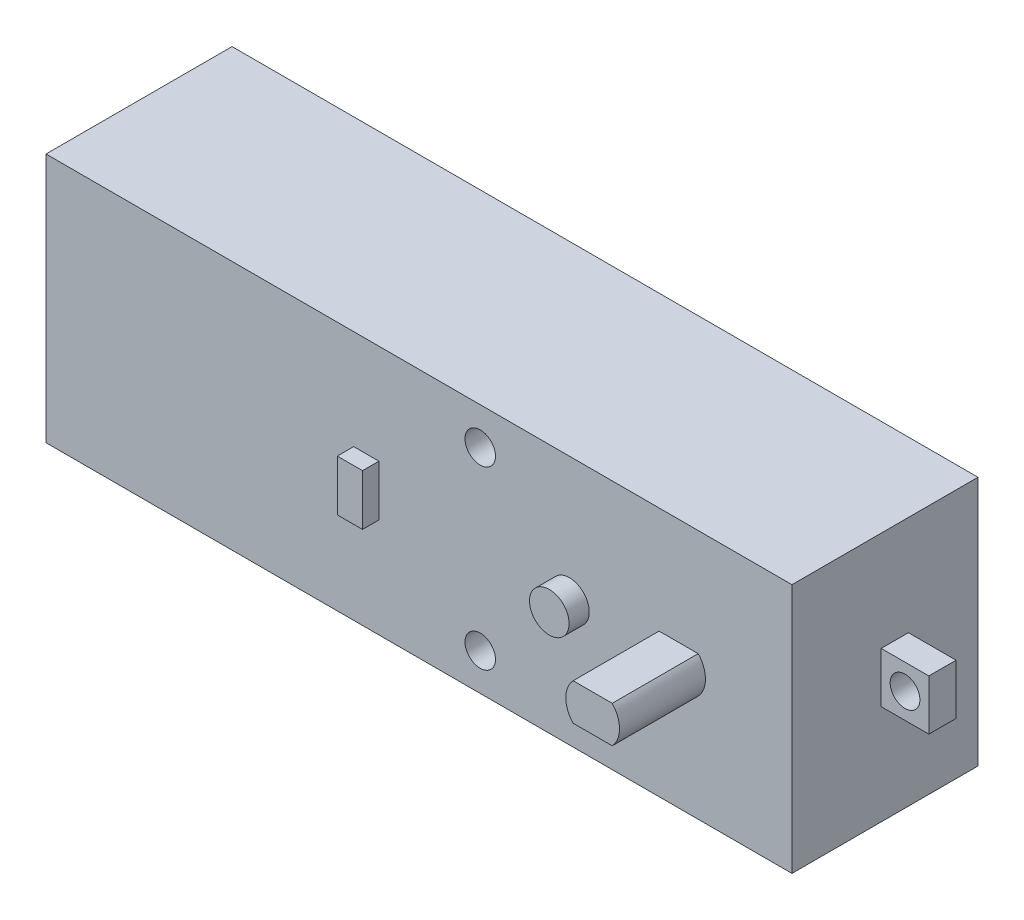
ISO-10303-21;
HEADER;
FILE_DESCRIPTION(('STEP AP214'),'2;1');
FILE_NAME('part.step','',(''),(''),'','','');
FILE_SCHEMA(('AUTOMOTIVE_DESIGN { 1 0 10303 214 1 1 1 1 }'));
ENDSEC;
DATA;
#1=APPLICATION_CONTEXT('core data for automotive mechanical design processes');
#2=APPLICATION_PROTOCOL_DEFINITION('international standard','automotive_design',2000,#1);
#3=PRODUCT_CONTEXT('',#1,'mechanical');
#4=PRODUCT('Part','Part','',(#3));
#5=PRODUCT_RELATED_PRODUCT_CATEGORY('part','',(#4));
#6=PRODUCT_DEFINITION_FORMATION('','',#4);
#7=PRODUCT_DEFINITION_CONTEXT('part definition',#1,'design');
#8=PRODUCT_DEFINITION('design','',#6,#7);
#9=PRODUCT_DEFINITION_SHAPE('','',#8);
#10=(LENGTH_UNIT() NAMED_UNIT(*) SI_UNIT(.MILLI.,.METRE.));
#11=(NAMED_UNIT(*) PLANE_ANGLE_UNIT() SI_UNIT($,.RADIAN.));
#12=(NAMED_UNIT(*) SI_UNIT($,.STERADIAN.) SOLID_ANGLE_UNIT());
#13=UNCERTAINTY_MEASURE_WITH_UNIT(LENGTH_MEASURE(1.E-05),#10,'distance_accuracy_value','');
#14=(GEOMETRIC_REPRESENTATION_CONTEXT(3) GLOBAL_UNCERTAINTY_ASSIGNED_CONTEXT((#13)) GLOBAL_UNIT_ASSIGNED_CONTEXT((#10,
#11,#12)) REPRESENTATION_CONTEXT('',''));
#15=CARTESIAN_POINT('',(0.,0.,0.));
#16=DIRECTION('',(0.,0.,1.));
#17=DIRECTION('',(1.,0.,0.));
#18=AXIS2_PLACEMENT_3D('',#15,#16,#17);
#19=CARTESIAN_POINT('',(0.,0.,18.7452));
#20=DIRECTION('',(0.,0.,-1.));
#21=DIRECTION('',(-1.,0.,0.));
#22=AXIS2_PLACEMENT_3D('',#19,#20,#21);
#23=PLANE('',#22);
#24=DIRECTION('',(0.,-1.,0.));
#25=VECTOR('',#24,1.);
#26=CARTESIAN_POINT('',(0.,0.,18.7452));
#27=LINE('',#26,#25);
#28=CARTESIAN_POINT('',(0.,25.1968,18.7452));
#29=VERTEX_POINT('',#28);
#30=CARTESIAN_POINT('',(0.,0.,18.7452));
#31=VERTEX_POINT('',#30);
#32=EDGE_CURVE('E301',#29,#31,#27,.T.);
#33=ORIENTED_EDGE('',*,*,#32,.T.);
#34=DIRECTION('',(1.,0.,0.));
#35=VECTOR('',#34,1.);
#36=CARTESIAN_POINT('',(0.,0.,18.7452));
#37=LINE('',#36,#35);
#38=CARTESIAN_POINT('',(75.1586,-7.49400541621981E-13,18.7452000000015));
#39=VERTEX_POINT('',#38);
#40=EDGE_CURVE('E305',#31,#39,#37,.T.);
#41=ORIENTED_EDGE('',*,*,#40,.T.);
#42=DIRECTION('',(0.,1.,0.));
#43=VECTOR('',#42,1.);
#44=CARTESIAN_POINT('',(75.1586,-7.49400541621981E-13,18.7452000000015));
#45=LINE('',#44,#43);
#46=CARTESIAN_POINT('',(75.1586,25.1967999999992,18.7452000000015));
#47=VERTEX_POINT('',#46);
#48=EDGE_CURVE('E309',#39,#47,#45,.T.);
#49=ORIENTED_EDGE('',*,*,#48,.T.);
#50=DIRECTION('',(-1.,0.,0.));
#51=VECTOR('',#50,1.);
#52=CARTESIAN_POINT('',(0.,25.1968,18.7452));
#53=LINE('',#52,#51);
#54=EDGE_CURVE('E312',#47,#29,#53,.T.);
#55=ORIENTED_EDGE('',*,*,#54,.T.);
#56=EDGE_LOOP('',(#33,#41,#49,#55));
#57=FACE_BOUND('',#56,.T.);
#58=CARTESIAN_POINT('',(52.7431,12.5983999999993,18.7452));
#59=DIRECTION('',(0.,0.,-1.));
#60=DIRECTION('',(-1.,0.,0.));
#61=AXIS2_PLACEMENT_3D('',#58,#59,#60);
#62=CIRCLE('',#61,1.9939);
#63=CARTESIAN_POINT('',(50.7492,12.5983999999993,18.7452));
#64=VERTEX_POINT('',#63);
#65=EDGE_CURVE('E342',#64,#64,#62,.F.);
#66=ORIENTED_EDGE('',*,*,#65,.F.);
#67=EDGE_LOOP('',(#66));
#68=FACE_BOUND('',#67,.T.);
#69=CARTESIAN_POINT('',(63.7413,12.5983999999993,18.7452));
#70=DIRECTION('',(0.,0.,-1.));
#71=DIRECTION('',(-1.,0.,0.));
#72=AXIS2_PLACEMENT_3D('',#69,#70,#71);
#73=CIRCLE('',#72,2.7051);
#74=CARTESIAN_POINT('',(65.7109467627471,10.7441999999992,18.7452000000015));
#75=VERTEX_POINT('',#74);
#76=CARTESIAN_POINT('',(65.7109467627471,14.4525999999992,18.7452000000015));
#77=VERTEX_POINT('',#76);
#78=EDGE_CURVE('E13',#75,#77,#73,.F.);
#79=ORIENTED_EDGE('',*,*,#78,.F.);
#80=DIRECTION('',(1.,0.,0.));
#81=VECTOR('',#80,1.);
#82=CARTESIAN_POINT('',(0.,10.7442,18.7452));
#83=LINE('',#82,#81);
#84=CARTESIAN_POINT('',(61.7716532372529,10.7441999999992,18.7452));
#85=VERTEX_POINT('',#84);
#86=EDGE_CURVE('E210',#85,#75,#83,.T.);
#87=ORIENTED_EDGE('',*,*,#86,.F.);
#88=CARTESIAN_POINT('',(61.7716532372529,14.4525999999992,18.7452));
#89=VERTEX_POINT('',#88);
#90=EDGE_CURVE('E60',#89,#85,#73,.F.);
#91=ORIENTED_EDGE('',*,*,#90,.F.);
#92=DIRECTION('',(1.,0.,0.));
#93=VECTOR('',#92,1.);
#94=CARTESIAN_POINT('',(0.,14.4526,18.7452));
#95=LINE('',#94,#93);
#96=EDGE_CURVE('E221',#89,#77,#95,.T.);
#97=ORIENTED_EDGE('',*,*,#96,.T.);
#98=EDGE_LOOP('',(#79,#87,#91,#97));
#99=FACE_BOUND('',#98,.T.);
#100=CARTESIAN_POINT('',(43.7515,3.73379999999926,18.7452000000015));
#101=DIRECTION('',(0.,0.,1.));
#102=DIRECTION('',(1.,0.,0.));
#103=AXIS2_PLACEMENT_3D('',#100,#101,#102);
#104=CIRCLE('',#103,1.5367);
#105=CARTESIAN_POINT('',(45.2882,3.73379999999924,18.7452000000015));
#106=VERTEX_POINT('',#105);
#107=EDGE_CURVE('E194',#106,#106,#104,.T.);
#108=ORIENTED_EDGE('',*,*,#107,.F.);
#109=EDGE_LOOP('',(#108));
#110=FACE_BOUND('',#109,.T.);
#111=CARTESIAN_POINT('',(43.7515,21.4629999999993,18.7452000000001));
#112=DIRECTION('',(0.,0.,1.));
#113=DIRECTION('',(1.,0.,0.));
#114=AXIS2_PLACEMENT_3D('',#111,#112,#113);
#115=CIRCLE('',#114,1.5367);
#116=CARTESIAN_POINT('',(45.2882,21.4629999999992,18.7452000000001));
#117=VERTEX_POINT('',#116);
#118=EDGE_CURVE('E211',#117,#117,#115,.T.);
#119=ORIENTED_EDGE('',*,*,#118,.F.);
#120=EDGE_LOOP('',(#119));
#121=FACE_BOUND('',#120,.T.);
#122=DIRECTION('',(0.,-1.,0.));
#123=VECTOR('',#122,1.);
#124=CARTESIAN_POINT('',(31.0007,15.1638,18.7452));
#125=LINE('',#124,#123);
#126=CARTESIAN_POINT('',(31.0007,15.1638,18.7452));
#127=VERTEX_POINT('',#126);
#128=CARTESIAN_POINT('',(31.0007,10.033,18.7452));
#129=VERTEX_POINT('',#128);
#130=EDGE_CURVE('E192',#127,#129,#125,.T.);
#131=ORIENTED_EDGE('',*,*,#130,.F.);
#132=DIRECTION('',(-1.,0.,0.));
#133=VECTOR('',#132,1.);
#134=CARTESIAN_POINT('',(31.0007,15.1638,18.7452));
#135=LINE('',#134,#133);
#136=CARTESIAN_POINT('',(33.5407,15.1638,18.7452000000015));
#137=VERTEX_POINT('',#136);
#138=EDGE_CURVE('E189',#137,#127,#135,.T.);
#139=ORIENTED_EDGE('',*,*,#138,.F.);
#140=DIRECTION('',(0.,1.,0.));
#141=VECTOR('',#140,1.);
#142=CARTESIAN_POINT('',(33.5407,15.1638,18.7452000000015));
#143=LINE('',#142,#141);
#144=CARTESIAN_POINT('',(33.5407,10.033,18.7452000000015));
#145=VERTEX_POINT('',#144);
#146=EDGE_CURVE('E77',#145,#137,#143,.T.);
#147=ORIENTED_EDGE('',*,*,#146,.F.);
#148=DIRECTION('',(1.,0.,0.));
#149=VECTOR('',#148,1.);
#150=CARTESIAN_POINT('',(31.0007,10.033,18.7452));
#151=LINE('',#150,#149);
#152=EDGE_CURVE('E72',#129,#145,#151,.T.);
#153=ORIENTED_EDGE('',*,*,#152,.F.);
#154=EDGE_LOOP('',(#131,#139,#147,#153));
#155=FACE_BOUND('',#154,.T.);
#156=ADVANCED_FACE('F56',(#57,#68,#99,#110,#121,#155),#23,.F.);
#157=CARTESIAN_POINT('',(63.7413000000001,12.5983999999993,27.4066));
#158=DIRECTION('',(0.,0.,-1.));
#159=DIRECTION('',(-1.,0.,0.));
#160=AXIS2_PLACEMENT_3D('',#157,#158,#159);
#161=CYLINDRICAL_SURFACE('',#160,2.7051);
#162=CARTESIAN_POINT('',(63.7413000000001,12.5983999999993,27.4066));
#163=DIRECTION('',(0.,0.,1.));
#164=DIRECTION('',(1.,0.,0.));
#165=AXIS2_PLACEMENT_3D('',#162,#163,#164);
#166=CIRCLE('',#165,2.7051);
#167=CARTESIAN_POINT('',(61.771653237253,14.4525999999992,27.4066));
#168=VERTEX_POINT('',#167);
#169=CARTESIAN_POINT('',(61.771653237253,10.7441999999992,27.4066));
#170=VERTEX_POINT('',#169);
#171=EDGE_CURVE('E249',#168,#170,#166,.T.);
#172=ORIENTED_EDGE('',*,*,#171,.F.);
#173=DIRECTION('',(0.,0.,1.));
#174=VECTOR('',#173,1.);
#175=CARTESIAN_POINT('',(61.7716532372544,14.4525999999992,14.7150555497352));
#176=LINE('',#175,#174);
#177=EDGE_CURVE('E230',#89,#168,#176,.T.);
#178=ORIENTED_EDGE('',*,*,#177,.F.);
#179=ORIENTED_EDGE('',*,*,#90,.T.);
#180=DIRECTION('',(0.,0.,1.));
#181=VECTOR('',#180,1.);
#182=CARTESIAN_POINT('',(61.7716532372544,10.7441999999992,14.7150555497352));
#183=LINE('',#182,#181);
#184=EDGE_CURVE('E237',#85,#170,#183,.T.);
#185=ORIENTED_EDGE('',*,*,#184,.T.);
#186=EDGE_LOOP('',(#172,#178,#179,#185));
#187=FACE_BOUND('',#186,.T.);
#188=ADVANCED_FACE('F357',(#187),#161,.T.);
#189=ORIENTED_EDGE('',*,*,#78,.T.);
#190=DIRECTION('',(0.,0.,1.));
#191=VECTOR('',#190,1.);
#192=CARTESIAN_POINT('',(65.7109467627486,14.4525999999992,14.7150555497367));
#193=LINE('',#192,#191);
#194=CARTESIAN_POINT('',(65.7109467627472,14.4525999999992,27.4066000000015));
#195=VERTEX_POINT('',#194);
#196=EDGE_CURVE('E226',#77,#195,#193,.T.);
#197=ORIENTED_EDGE('',*,*,#196,.T.);
#198=CARTESIAN_POINT('',(65.7109467627472,10.7441999999992,27.4066000000015));
#199=VERTEX_POINT('',#198);
#200=EDGE_CURVE('E233',#199,#195,#166,.T.);
#201=ORIENTED_EDGE('',*,*,#200,.F.);
#202=DIRECTION('',(0.,0.,1.));
#203=VECTOR('',#202,1.);
#204=CARTESIAN_POINT('',(65.7109467627486,10.7441999999992,14.7150555497367));
#205=LINE('',#204,#203);
#206=EDGE_CURVE('E240',#75,#199,#205,.T.);
#207=ORIENTED_EDGE('',*,*,#206,.F.);
#208=EDGE_LOOP('',(#189,#197,#201,#207));
#209=FACE_BOUND('',#208,.T.);
#210=ADVANCED_FACE('F371',(#209),#161,.T.);
#211=CARTESIAN_POINT('',(63.7413000000001,12.5983999999993,27.4066));
#212=DIRECTION('',(0.,0.,1.));
#213=DIRECTION('',(1.,0.,0.));
#214=AXIS2_PLACEMENT_3D('',#211,#212,#213);
#215=PLANE('',#214);
#216=DIRECTION('',(1.,0.,0.));
#217=VECTOR('',#216,1.);
#218=CARTESIAN_POINT('',(0.,14.4526,27.4066));
#219=LINE('',#218,#217);
#220=EDGE_CURVE('E218',#168,#195,#219,.T.);
#221=ORIENTED_EDGE('',*,*,#220,.F.);
#222=ORIENTED_EDGE('',*,*,#171,.T.);
#223=DIRECTION('',(1.,0.,0.));
#224=VECTOR('',#223,1.);
#225=CARTESIAN_POINT('',(0.,10.7442,27.4066));
#226=LINE('',#225,#224);
#227=EDGE_CURVE('E222',#170,#199,#226,.T.);
#228=ORIENTED_EDGE('',*,*,#227,.T.);
#229=ORIENTED_EDGE('',*,*,#200,.T.);
#230=EDGE_LOOP('',(#221,#222,#228,#229));
#231=FACE_BOUND('',#230,.T.);
#232=ADVANCED_FACE('F369',(#231),#215,.T.);
#233=CARTESIAN_POINT('',(75.1586,-7.49400541621981E-13,18.7452000000015));
#234=DIRECTION('',(-1.,0.,0.));
#235=DIRECTION('',(0.,0.,1.));
#236=AXIS2_PLACEMENT_3D('',#233,#234,#235);
#237=PLANE('',#236);
#238=DIRECTION('',(0.,1.,0.));
#239=VECTOR('',#238,1.);
#240=CARTESIAN_POINT('',(75.1586,-7.49400541621981E-13,1.49880108324396E-12));
#241=LINE('',#240,#239);
#242=CARTESIAN_POINT('',(75.1586,-7.49400541621981E-13,1.49880108324396E-12));
#243=VERTEX_POINT('',#242);
#244=CARTESIAN_POINT('',(75.1586,25.1967999999992,1.49880108324396E-12));
#245=VERTEX_POINT('',#244);
#246=EDGE_CURVE('E322',#243,#245,#241,.T.);
#247=ORIENTED_EDGE('',*,*,#246,.T.);
#248=DIRECTION('',(0.,0.,-1.));
#249=VECTOR('',#248,1.);
#250=CARTESIAN_POINT('',(75.1586,25.1967999999992,18.7452000000015));
#251=LINE('',#250,#249);
#252=EDGE_CURVE('E330',#47,#245,#251,.T.);
#253=ORIENTED_EDGE('',*,*,#252,.F.);
#254=ORIENTED_EDGE('',*,*,#48,.F.);
#255=DIRECTION('',(0.,0.,-1.));
#256=VECTOR('',#255,1.);
#257=CARTESIAN_POINT('',(75.1586,-7.49400541621981E-13,18.7452000000015));
#258=LINE('',#257,#256);
#259=EDGE_CURVE('E334',#39,#243,#258,.T.);
#260=ORIENTED_EDGE('',*,*,#259,.T.);
#261=EDGE_LOOP('',(#247,#253,#254,#260));
#262=FACE_BOUND('',#261,.T.);
#263=DIRECTION('',(0.,-1.,0.));
#264=VECTOR('',#263,1.);
#265=CARTESIAN_POINT('',(75.1586,10.0583999999992,9.75360000000147));
#266=LINE('',#265,#264);
#267=CARTESIAN_POINT('',(75.1586,15.1383999999992,9.75360000000147));
#268=VERTEX_POINT('',#267);
#269=CARTESIAN_POINT('',(75.1586,10.0583999999992,9.75360000000147));
#270=VERTEX_POINT('',#269);
#271=EDGE_CURVE('E259',#268,#270,#266,.T.);
#272=ORIENTED_EDGE('',*,*,#271,.F.);
#273=DIRECTION('',(0.,0.,-1.));
#274=VECTOR('',#273,1.);
#275=CARTESIAN_POINT('',(75.1586,15.1383999999992,9.75360000000147));
#276=LINE('',#275,#274);
#277=CARTESIAN_POINT('',(75.1586000000015,15.1383999999992,7.01040000000147));
#278=VERTEX_POINT('',#277);
#279=EDGE_CURVE('E273',#268,#278,#276,.T.);
#280=ORIENTED_EDGE('',*,*,#279,.T.);
#281=DIRECTION('',(0.,-1.,0.));
#282=VECTOR('',#281,1.);
#283=CARTESIAN_POINT('',(75.1586000000015,10.0583999999992,7.01040000000147));
#284=LINE('',#283,#282);
#285=CARTESIAN_POINT('',(75.1586000000015,10.0583999999992,7.01040000000147));
#286=VERTEX_POINT('',#285);
#287=EDGE_CURVE('E274',#278,#286,#284,.T.);
#288=ORIENTED_EDGE('',*,*,#287,.T.);
#289=DIRECTION('',(0.,0.,-1.));
#290=VECTOR('',#289,1.);
#291=CARTESIAN_POINT('',(75.1586,10.0583999999992,9.75360000000147));
#292=LINE('',#291,#290);
#293=EDGE_CURVE('E297',#270,#286,#292,.T.);
#294=ORIENTED_EDGE('',*,*,#293,.F.);
#295=EDGE_LOOP('',(#272,#280,#288,#294));
#296=FACE_BOUND('',#295,.T.);
#297=ADVANCED_FACE('F449',(#262,#296),#237,.F.);
#298=CARTESIAN_POINT('',(0.,0.,18.7452));
#299=DIRECTION('',(1.,0.,0.));
#300=DIRECTION('',(0.,0.,-1.));
#301=AXIS2_PLACEMENT_3D('',#298,#299,#300);
#302=PLANE('',#301);
#303=DIRECTION('',(0.,-1.,0.));
#304=VECTOR('',#303,1.);
#305=CARTESIAN_POINT('',(0.,0.,0.));
#306=LINE('',#305,#304);
#307=CARTESIAN_POINT('',(0.,25.1968,0.));
#308=VERTEX_POINT('',#307);
#309=CARTESIAN_POINT('',(0.,0.,0.));
#310=VERTEX_POINT('',#309);
#311=EDGE_CURVE('E300',#308,#310,#306,.T.);
#312=ORIENTED_EDGE('',*,*,#311,.T.);
#313=DIRECTION('',(0.,0.,-1.));
#314=VECTOR('',#313,1.);
#315=CARTESIAN_POINT('',(0.,0.,18.7452));
#316=LINE('',#315,#314);
#317=EDGE_CURVE('E338',#31,#310,#316,.T.);
#318=ORIENTED_EDGE('',*,*,#317,.F.);
#319=ORIENTED_EDGE('',*,*,#32,.F.);
#320=DIRECTION('',(0.,0.,-1.));
#321=VECTOR('',#320,1.);
#322=CARTESIAN_POINT('',(0.,25.1968,18.7452));
#323=LINE('',#322,#321);
#324=EDGE_CURVE('E315',#29,#308,#323,.T.);
#325=ORIENTED_EDGE('',*,*,#324,.T.);
#326=EDGE_LOOP('',(#312,#318,#319,#325));
#327=FACE_BOUND('',#326,.T.);
#328=ADVANCED_FACE('F58',(#327),#302,.F.);
#329=CARTESIAN_POINT('',(0.,0.,18.7452));
#330=DIRECTION('',(0.,1.,0.));
#331=DIRECTION('',(0.,0.,1.));
#332=AXIS2_PLACEMENT_3D('',#329,#330,#331);
#333=PLANE('',#332);
#334=DIRECTION('',(1.,0.,0.));
#335=VECTOR('',#334,1.);
#336=CARTESIAN_POINT('',(0.,0.,0.));
#337=LINE('',#336,#335);
#338=EDGE_CURVE('E319',#310,#243,#337,.T.);
#339=ORIENTED_EDGE('',*,*,#338,.T.);
#340=ORIENTED_EDGE('',*,*,#259,.F.);
#341=ORIENTED_EDGE('',*,*,#40,.F.);
#342=ORIENTED_EDGE('',*,*,#317,.T.);
#343=EDGE_LOOP('',(#339,#340,#341,#342));
#344=FACE_BOUND('',#343,.T.);
#345=ADVANCED_FACE('F447',(#344),#333,.F.);
#346=CARTESIAN_POINT('',(0.,25.1968,18.7452));
#347=DIRECTION('',(0.,-1.,0.));
#348=DIRECTION('',(0.,0.,-1.));
#349=AXIS2_PLACEMENT_3D('',#346,#347,#348);
#350=PLANE('',#349);
#351=DIRECTION('',(-1.,0.,0.));
#352=VECTOR('',#351,1.);
#353=CARTESIAN_POINT('',(0.,25.1968,0.));
#354=LINE('',#353,#352);
#355=EDGE_CURVE('E306',#245,#308,#354,.T.);
#356=ORIENTED_EDGE('',*,*,#355,.T.);
#357=ORIENTED_EDGE('',*,*,#324,.F.);
#358=ORIENTED_EDGE('',*,*,#54,.F.);
#359=ORIENTED_EDGE('',*,*,#252,.T.);
#360=EDGE_LOOP('',(#356,#357,#358,#359));
#361=FACE_BOUND('',#360,.T.);
#362=ADVANCED_FACE('F443',(#361),#350,.F.);
#363=CARTESIAN_POINT('',(0.,0.,0.));
#364=DIRECTION('',(0.,0.,-1.));
#365=DIRECTION('',(-1.,0.,0.));
#366=AXIS2_PLACEMENT_3D('',#363,#364,#365);
#367=PLANE('',#366);
#368=CARTESIAN_POINT('',(43.7515,21.4629999999993,1.49880108324396E-12));
#369=DIRECTION('',(0.,0.,1.));
#370=DIRECTION('',(1.,0.,0.));
#371=AXIS2_PLACEMENT_3D('',#368,#369,#370);
#372=CIRCLE('',#371,1.5367);
#373=CARTESIAN_POINT('',(45.2882,21.4629999999992,1.49880108324396E-12));
#374=VERTEX_POINT('',#373);
#375=EDGE_CURVE('E206',#374,#374,#372,.T.);
#376=ORIENTED_EDGE('',*,*,#375,.T.);
#377=EDGE_LOOP('',(#376));
#378=FACE_BOUND('',#377,.T.);
#379=CARTESIAN_POINT('',(43.7515,3.73379999999926,1.49880108324396E-12));
#380=DIRECTION('',(0.,0.,1.));
#381=DIRECTION('',(1.,0.,0.));
#382=AXIS2_PLACEMENT_3D('',#379,#380,#381);
#383=CIRCLE('',#382,1.5367);
#384=CARTESIAN_POINT('',(45.2882,3.73379999999924,1.49880108324396E-12));
#385=VERTEX_POINT('',#384);
#386=EDGE_CURVE('E200',#385,#385,#383,.T.);
#387=ORIENTED_EDGE('',*,*,#386,.T.);
#388=EDGE_LOOP('',(#387));
#389=FACE_BOUND('',#388,.T.);
#390=ORIENTED_EDGE('',*,*,#311,.F.);
#391=ORIENTED_EDGE('',*,*,#355,.F.);
#392=ORIENTED_EDGE('',*,*,#246,.F.);
#393=ORIENTED_EDGE('',*,*,#338,.F.);
#394=EDGE_LOOP('',(#390,#391,#392,#393));
#395=FACE_BOUND('',#394,.T.);
#396=ADVANCED_FACE('F440',(#378,#389,#395),#367,.T.);
#397=CARTESIAN_POINT('',(75.1586,10.0583999999992,9.75360000000147));
#398=DIRECTION('',(0.,1.,0.));
#399=DIRECTION('',(0.,0.,1.));
#400=AXIS2_PLACEMENT_3D('',#397,#398,#399);
#401=PLANE('',#400);
#402=DIRECTION('',(1.,0.,0.));
#403=VECTOR('',#402,1.);
#404=CARTESIAN_POINT('',(75.1586000000015,10.0583999999992,7.01040000000147));
#405=LINE('',#404,#403);
#406=CARTESIAN_POINT('',(79.9592000000015,10.0583999999992,7.01040000000003));
#407=VERTEX_POINT('',#406);
#408=EDGE_CURVE('E278',#286,#407,#405,.T.);
#409=ORIENTED_EDGE('',*,*,#408,.T.);
#410=DIRECTION('',(0.,0.,-1.));
#411=VECTOR('',#410,1.);
#412=CARTESIAN_POINT('',(79.9592,10.0583999999992,9.75359999999997));
#413=LINE('',#412,#411);
#414=CARTESIAN_POINT('',(79.9592,10.0583999999992,9.75359999999997));
#415=VERTEX_POINT('',#414);
#416=EDGE_CURVE('E293',#415,#407,#413,.T.);
#417=ORIENTED_EDGE('',*,*,#416,.F.);
#418=DIRECTION('',(1.,0.,0.));
#419=VECTOR('',#418,1.);
#420=CARTESIAN_POINT('',(75.1586,10.0583999999992,9.75360000000147));
#421=LINE('',#420,#419);
#422=EDGE_CURVE('E263',#270,#415,#421,.T.);
#423=ORIENTED_EDGE('',*,*,#422,.F.);
#424=ORIENTED_EDGE('',*,*,#293,.T.);
#425=EDGE_LOOP('',(#409,#417,#423,#424));
#426=FACE_BOUND('',#425,.T.);
#427=ADVANCED_FACE('F438',(#426),#401,.F.);
#428=CARTESIAN_POINT('',(79.9592,10.0583999999992,9.75359999999997));
#429=DIRECTION('',(-1.,0.,0.));
#430=DIRECTION('',(0.,0.,1.));
#431=AXIS2_PLACEMENT_3D('',#428,#429,#430);
#432=PLANE('',#431);
#433=DIRECTION('',(0.,1.,0.));
#434=VECTOR('',#433,1.);
#435=CARTESIAN_POINT('',(79.9592000000015,10.0583999999992,7.01040000000003));
#436=LINE('',#435,#434);
#437=CARTESIAN_POINT('',(79.9592000000015,15.1383999999992,7.01039999999997));
#438=VERTEX_POINT('',#437);
#439=EDGE_CURVE('E281',#407,#438,#436,.T.);
#440=ORIENTED_EDGE('',*,*,#439,.T.);
#441=DIRECTION('',(0.,0.,-1.));
#442=VECTOR('',#441,1.);
#443=CARTESIAN_POINT('',(79.9592,15.1383999999992,9.75359999999997));
#444=LINE('',#443,#442);
#445=CARTESIAN_POINT('',(79.9592,15.1383999999992,9.75359999999997));
#446=VERTEX_POINT('',#445);
#447=EDGE_CURVE('E289',#446,#438,#444,.T.);
#448=ORIENTED_EDGE('',*,*,#447,.F.);
#449=DIRECTION('',(0.,1.,0.));
#450=VECTOR('',#449,1.);
#451=CARTESIAN_POINT('',(79.9592,10.0583999999992,9.75359999999997));
#452=LINE('',#451,#450);
#453=EDGE_CURVE('E267',#415,#446,#452,.T.);
#454=ORIENTED_EDGE('',*,*,#453,.F.);
#455=ORIENTED_EDGE('',*,*,#416,.T.);
#456=EDGE_LOOP('',(#440,#448,#454,#455));
#457=FACE_BOUND('',#456,.T.);
#458=ADVANCED_FACE('F489',(#457),#432,.F.);
#459=CARTESIAN_POINT('',(75.1586,15.1383999999992,9.75360000000147));
#460=DIRECTION('',(0.,-1.,0.));
#461=DIRECTION('',(1.,0.,0.));
#462=AXIS2_PLACEMENT_3D('',#459,#460,#461);
#463=PLANE('',#462);
#464=DIRECTION('',(-1.,0.,0.));
#465=VECTOR('',#464,1.);
#466=CARTESIAN_POINT('',(75.1586000000015,15.1383999999992,7.01040000000147));
#467=LINE('',#466,#465);
#468=EDGE_CURVE('E264',#438,#278,#467,.T.);
#469=ORIENTED_EDGE('',*,*,#468,.T.);
#470=ORIENTED_EDGE('',*,*,#279,.F.);
#471=DIRECTION('',(-1.,0.,0.));
#472=VECTOR('',#471,1.);
#473=CARTESIAN_POINT('',(75.1586,15.1383999999992,9.75360000000147));
#474=LINE('',#473,#472);
#475=EDGE_CURVE('E270',#446,#268,#474,.T.);
#476=ORIENTED_EDGE('',*,*,#475,.F.);
#477=ORIENTED_EDGE('',*,*,#447,.T.);
#478=EDGE_LOOP('',(#469,#470,#476,#477));
#479=FACE_BOUND('',#478,.T.);
#480=ADVANCED_FACE('F480',(#479),#463,.F.);
#481=CARTESIAN_POINT('',(0.,0.,9.75359999999997));
#482=DIRECTION('',(0.,0.,-1.));
#483=DIRECTION('',(-1.,0.,0.));
#484=AXIS2_PLACEMENT_3D('',#481,#482,#483);
#485=PLANE('',#484);
#486=CARTESIAN_POINT('',(77.5589,12.5983999999993,9.75360000000003));
#487=DIRECTION('',(0.,0.,1.));
#488=DIRECTION('',(1.,0.,0.));
#489=AXIS2_PLACEMENT_3D('',#486,#487,#488);
#490=CIRCLE('',#489,1.4986);
#491=CARTESIAN_POINT('',(79.0575,12.5983999999992,9.75360000000003));
#492=VERTEX_POINT('',#491);
#493=EDGE_CURVE('E254',#492,#492,#490,.T.);
#494=ORIENTED_EDGE('',*,*,#493,.F.);
#495=EDGE_LOOP('',(#494));
#496=FACE_BOUND('',#495,.T.);
#497=ORIENTED_EDGE('',*,*,#271,.T.);
#498=ORIENTED_EDGE('',*,*,#422,.T.);
#499=ORIENTED_EDGE('',*,*,#453,.T.);
#500=ORIENTED_EDGE('',*,*,#475,.T.);
#501=EDGE_LOOP('',(#497,#498,#499,#500));
#502=FACE_BOUND('',#501,.T.);
#503=ADVANCED_FACE('F474',(#496,#502),#485,.F.);
#504=CARTESIAN_POINT('',(1.49880108324396E-12,0.,7.01039999999997));
#505=DIRECTION('',(0.,0.,-1.));
#506=DIRECTION('',(-1.,0.,0.));
#507=AXIS2_PLACEMENT_3D('',#504,#505,#506);
#508=PLANE('',#507);
#509=CARTESIAN_POINT('',(77.5589000000015,12.5983999999993,7.01040000000003));
#510=DIRECTION('',(0.,0.,-1.));
#511=DIRECTION('',(-1.,0.,0.));
#512=AXIS2_PLACEMENT_3D('',#509,#510,#511);
#513=CIRCLE('',#512,1.4986);
#514=CARTESIAN_POINT('',(76.0603000000015,12.5983999999993,7.01040000000003));
#515=VERTEX_POINT('',#514);
#516=EDGE_CURVE('E258',#515,#515,#513,.T.);
#517=ORIENTED_EDGE('',*,*,#516,.F.);
#518=EDGE_LOOP('',(#517));
#519=FACE_BOUND('',#518,.T.);
#520=ORIENTED_EDGE('',*,*,#287,.F.);
#521=ORIENTED_EDGE('',*,*,#468,.F.);
#522=ORIENTED_EDGE('',*,*,#439,.F.);
#523=ORIENTED_EDGE('',*,*,#408,.F.);
#524=EDGE_LOOP('',(#520,#521,#522,#523));
#525=FACE_BOUND('',#524,.T.);
#526=ADVANCED_FACE('F486',(#519,#525),#508,.T.);
#527=CARTESIAN_POINT('',(77.5589,12.5983999999993,0.));
#528=DIRECTION('',(0.,0.,1.));
#529=DIRECTION('',(1.,0.,0.));
#530=AXIS2_PLACEMENT_3D('',#527,#528,#529);
#531=CYLINDRICAL_SURFACE('',#530,1.4986);
#532=ORIENTED_EDGE('',*,*,#516,.T.);
#533=EDGE_LOOP('',(#532));
#534=FACE_BOUND('',#533,.T.);
#535=ORIENTED_EDGE('',*,*,#493,.T.);
#536=EDGE_LOOP('',(#535));
#537=FACE_BOUND('',#536,.T.);
#538=ADVANCED_FACE('F499',(#534,#537),#531,.F.);
#539=CARTESIAN_POINT('',(52.7431000000002,12.5983999999993,20.7772));
#540=DIRECTION('',(0.,0.,-1.));
#541=DIRECTION('',(-1.,0.,0.));
#542=AXIS2_PLACEMENT_3D('',#539,#540,#541);
#543=CYLINDRICAL_SURFACE('',#542,1.9939);
#544=CARTESIAN_POINT('',(52.7431000000002,12.5983999999993,20.7772));
#545=DIRECTION('',(0.,0.,1.));
#546=DIRECTION('',(1.,0.,0.));
#547=AXIS2_PLACEMENT_3D('',#544,#545,#546);
#548=CIRCLE('',#547,1.9939);
#549=CARTESIAN_POINT('',(54.7370000000002,12.5983999999992,20.7772));
#550=VERTEX_POINT('',#549);
#551=EDGE_CURVE('E250',#550,#550,#548,.T.);
#552=ORIENTED_EDGE('',*,*,#551,.F.);
#553=EDGE_LOOP('',(#552));
#554=FACE_BOUND('',#553,.T.);
#555=ORIENTED_EDGE('',*,*,#65,.T.);
#556=EDGE_LOOP('',(#555));
#557=FACE_BOUND('',#556,.T.);
#558=ADVANCED_FACE('F506',(#554,#557),#543,.T.);
#559=CARTESIAN_POINT('',(52.7431000000002,12.5983999999993,20.7772));
#560=DIRECTION('',(0.,0.,1.));
#561=DIRECTION('',(1.,0.,0.));
#562=AXIS2_PLACEMENT_3D('',#559,#560,#561);
#563=PLANE('',#562);
#564=ORIENTED_EDGE('',*,*,#551,.T.);
#565=EDGE_LOOP('',(#564));
#566=FACE_BOUND('',#565,.T.);
#567=ADVANCED_FACE('F426',(#566),#563,.T.);
#568=CARTESIAN_POINT('',(1.49880108324396E-12,10.7442,14.7150555497352));
#569=DIRECTION('',(0.,-1.,0.));
#570=DIRECTION('',(0.,0.,-1.));
#571=AXIS2_PLACEMENT_3D('',#568,#569,#570);
#572=PLANE('',#571);
#573=ORIENTED_EDGE('',*,*,#86,.T.);
#574=ORIENTED_EDGE('',*,*,#206,.T.);
#575=ORIENTED_EDGE('',*,*,#227,.F.);
#576=ORIENTED_EDGE('',*,*,#184,.F.);
#577=EDGE_LOOP('',(#573,#574,#575,#576));
#578=FACE_BOUND('',#577,.T.);
#579=ADVANCED_FACE('F365',(#578),#572,.T.);
#580=CARTESIAN_POINT('',(1.49880108324396E-12,14.4526,14.7150555497352));
#581=DIRECTION('',(0.,-1.,0.));
#582=DIRECTION('',(0.,0.,-1.));
#583=AXIS2_PLACEMENT_3D('',#580,#581,#582);
#584=PLANE('',#583);
#585=ORIENTED_EDGE('',*,*,#177,.T.);
#586=ORIENTED_EDGE('',*,*,#220,.T.);
#587=ORIENTED_EDGE('',*,*,#196,.F.);
#588=ORIENTED_EDGE('',*,*,#96,.F.);
#589=EDGE_LOOP('',(#585,#586,#587,#588));
#590=FACE_BOUND('',#589,.T.);
#591=ADVANCED_FACE('F373',(#590),#584,.F.);
#592=CARTESIAN_POINT('',(43.7515,3.73379999999926,1.49880108324396E-12));
#593=DIRECTION('',(0.,0.,1.));
#594=DIRECTION('',(1.,0.,0.));
#595=AXIS2_PLACEMENT_3D('',#592,#593,#594);
#596=CYLINDRICAL_SURFACE('',#595,1.5367);
#597=ORIENTED_EDGE('',*,*,#386,.F.);
#598=EDGE_LOOP('',(#597));
#599=FACE_BOUND('',#598,.T.);
#600=ORIENTED_EDGE('',*,*,#107,.T.);
#601=EDGE_LOOP('',(#600));
#602=FACE_BOUND('',#601,.T.);
#603=ADVANCED_FACE('F417',(#599,#602),#596,.F.);
#604=CARTESIAN_POINT('',(43.7515,21.4629999999993,1.49880108324396E-12));
#605=DIRECTION('',(0.,0.,1.));
#606=DIRECTION('',(1.,0.,0.));
#607=AXIS2_PLACEMENT_3D('',#604,#605,#606);
#608=CYLINDRICAL_SURFACE('',#607,1.5367);
#609=ORIENTED_EDGE('',*,*,#375,.F.);
#610=EDGE_LOOP('',(#609));
#611=FACE_BOUND('',#610,.T.);
#612=ORIENTED_EDGE('',*,*,#118,.T.);
#613=EDGE_LOOP('',(#612));
#614=FACE_BOUND('',#613,.T.);
#615=ADVANCED_FACE('F423',(#611,#614),#608,.F.);
#616=CARTESIAN_POINT('',(31.0007,15.1638,20.3962));
#617=DIRECTION('',(1.,0.,0.));
#618=DIRECTION('',(0.,0.,-1.));
#619=AXIS2_PLACEMENT_3D('',#616,#617,#618);
#620=PLANE('',#619);
#621=ORIENTED_EDGE('',*,*,#130,.T.);
#622=DIRECTION('',(0.,0.,-1.));
#623=VECTOR('',#622,1.);
#624=CARTESIAN_POINT('',(31.0007000000002,10.033,20.3962));
#625=LINE('',#624,#623);
#626=CARTESIAN_POINT('',(31.0007000000002,10.033,20.3962));
#627=VERTEX_POINT('',#626);
#628=EDGE_CURVE('E171',#627,#129,#625,.T.);
#629=ORIENTED_EDGE('',*,*,#628,.F.);
#630=DIRECTION('',(0.,-1.,0.));
#631=VECTOR('',#630,1.);
#632=CARTESIAN_POINT('',(31.0007,15.1638,20.3962));
#633=LINE('',#632,#631);
#634=CARTESIAN_POINT('',(31.0007,15.1638,20.3962));
#635=VERTEX_POINT('',#634);
#636=EDGE_CURVE('E179',#635,#627,#633,.T.);
#637=ORIENTED_EDGE('',*,*,#636,.F.);
#638=DIRECTION('',(0.,0.,-1.));
#639=VECTOR('',#638,1.);
#640=CARTESIAN_POINT('',(31.0007,15.1638,20.3962));
#641=LINE('',#640,#639);
#642=EDGE_CURVE('E692',#635,#127,#641,.T.);
#643=ORIENTED_EDGE('',*,*,#642,.T.);
#644=EDGE_LOOP('',(#621,#629,#637,#643));
#645=FACE_BOUND('',#644,.T.);
#646=ADVANCED_FACE('F191',(#645),#620,.F.);
#647=CARTESIAN_POINT('',(31.0007000000002,10.033,20.3962));
#648=DIRECTION('',(0.,1.,0.));
#649=DIRECTION('',(0.,0.,1.));
#650=AXIS2_PLACEMENT_3D('',#647,#648,#649);
#651=PLANE('',#650);
#652=ORIENTED_EDGE('',*,*,#152,.T.);
#653=DIRECTION('',(0.,0.,-1.));
#654=VECTOR('',#653,1.);
#655=CARTESIAN_POINT('',(33.5407,10.033,20.3962000000015));
#656=LINE('',#655,#654);
#657=CARTESIAN_POINT('',(33.5407,10.033,20.3962000000015));
#658=VERTEX_POINT('',#657);
#659=EDGE_CURVE('E174',#658,#145,#656,.T.);
#660=ORIENTED_EDGE('',*,*,#659,.F.);
#661=DIRECTION('',(1.,0.,0.));
#662=VECTOR('',#661,1.);
#663=CARTESIAN_POINT('',(31.0007000000002,10.033,20.3962));
#664=LINE('',#663,#662);
#665=EDGE_CURVE('E167',#627,#658,#664,.T.);
#666=ORIENTED_EDGE('',*,*,#665,.F.);
#667=ORIENTED_EDGE('',*,*,#628,.T.);
#668=EDGE_LOOP('',(#652,#660,#666,#667));
#669=FACE_BOUND('',#668,.T.);
#670=ADVANCED_FACE('F169',(#669),#651,.F.);
#671=CARTESIAN_POINT('',(33.5407,15.1638,20.3962000000015));
#672=DIRECTION('',(-1.,0.,0.));
#673=DIRECTION('',(0.,0.,1.));
#674=AXIS2_PLACEMENT_3D('',#671,#672,#673);
#675=PLANE('',#674);
#676=ORIENTED_EDGE('',*,*,#146,.T.);
#677=DIRECTION('',(0.,0.,-1.));
#678=VECTOR('',#677,1.);
#679=CARTESIAN_POINT('',(33.5407,15.1638,20.3962000000015));
#680=LINE('',#679,#678);
#681=CARTESIAN_POINT('',(33.5407,15.1638,20.3962000000015));
#682=VERTEX_POINT('',#681);
#683=EDGE_CURVE('E202',#682,#137,#680,.T.);
#684=ORIENTED_EDGE('',*,*,#683,.F.);
#685=DIRECTION('',(0.,1.,0.));
#686=VECTOR('',#685,1.);
#687=CARTESIAN_POINT('',(33.5407,15.1638,20.3962000000015));
#688=LINE('',#687,#686);
#689=EDGE_CURVE('E178',#658,#682,#688,.T.);
#690=ORIENTED_EDGE('',*,*,#689,.F.);
#691=ORIENTED_EDGE('',*,*,#659,.T.);
#692=EDGE_LOOP('',(#676,#684,#690,#691));
#693=FACE_BOUND('',#692,.T.);
#694=ADVANCED_FACE('F551',(#693),#675,.F.);
#695=CARTESIAN_POINT('',(31.0007,15.1638,20.3962));
#696=DIRECTION('',(0.,-1.,0.));
#697=DIRECTION('',(0.,0.,-1.));
#698=AXIS2_PLACEMENT_3D('',#695,#696,#697);
#699=PLANE('',#698);
#700=ORIENTED_EDGE('',*,*,#138,.T.);
#701=ORIENTED_EDGE('',*,*,#642,.F.);
#702=DIRECTION('',(-1.,0.,0.));
#703=VECTOR('',#702,1.);
#704=CARTESIAN_POINT('',(31.0007,15.1638,20.3962));
#705=LINE('',#704,#703);
#706=EDGE_CURVE('E184',#682,#635,#705,.T.);
#707=ORIENTED_EDGE('',*,*,#706,.F.);
#708=ORIENTED_EDGE('',*,*,#683,.T.);
#709=EDGE_LOOP('',(#700,#701,#707,#708));
#710=FACE_BOUND('',#709,.T.);
#711=ADVANCED_FACE('F559',(#710),#699,.F.);
#712=CARTESIAN_POINT('',(1.49880108324396E-12,0.,20.3962));
#713=DIRECTION('',(0.,0.,1.));
#714=DIRECTION('',(1.,0.,0.));
#715=AXIS2_PLACEMENT_3D('',#712,#713,#714);
#716=PLANE('',#715);
#717=ORIENTED_EDGE('',*,*,#636,.T.);
#718=ORIENTED_EDGE('',*,*,#665,.T.);
#719=ORIENTED_EDGE('',*,*,#689,.T.);
#720=ORIENTED_EDGE('',*,*,#706,.T.);
#721=EDGE_LOOP('',(#717,#718,#719,#720));
#722=FACE_BOUND('',#721,.T.);
#723=ADVANCED_FACE('F182',(#722),#716,.T.);
#724=CLOSED_SHELL('',(#156,#188,#210,#232,#297,#328,#345,#362,#396,#427,#458,#480,#503,#526,
#538,#558,#567,#579,#591,#603,#615,#646,#670,#694,#711,#723));
#725=MANIFOLD_SOLID_BREP('B2',#724);
#726=ADVANCED_BREP_SHAPE_REPRESENTATION('',(#18,#725),#14);
#727=SHAPE_DEFINITION_REPRESENTATION(#9,#726);
ENDSEC;
END-ISO-10303-21;
